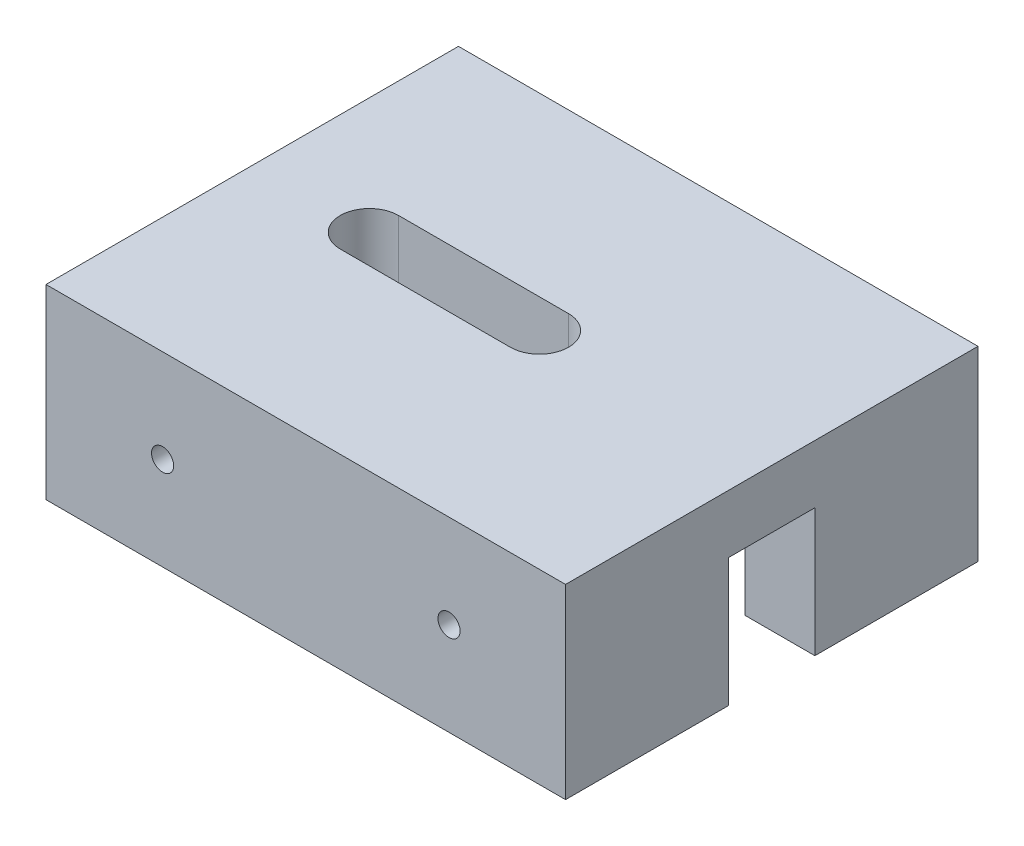
ISO-10303-21;
HEADER;
FILE_DESCRIPTION(('STEP AP214'),'2;1');
FILE_NAME('part.step','',(''),(''),'','','');
FILE_SCHEMA(('AUTOMOTIVE_DESIGN { 1 0 10303 214 1 1 1 1 }'));
ENDSEC;
DATA;
#1=APPLICATION_CONTEXT('core data for automotive mechanical design processes');
#2=APPLICATION_PROTOCOL_DEFINITION('international standard','automotive_design',2000,#1);
#3=PRODUCT_CONTEXT('',#1,'mechanical');
#4=PRODUCT('Part','Part','',(#3));
#5=PRODUCT_RELATED_PRODUCT_CATEGORY('part','',(#4));
#6=PRODUCT_DEFINITION_FORMATION('','',#4);
#7=PRODUCT_DEFINITION_CONTEXT('part definition',#1,'design');
#8=PRODUCT_DEFINITION('design','',#6,#7);
#9=PRODUCT_DEFINITION_SHAPE('','',#8);
#10=(LENGTH_UNIT() NAMED_UNIT(*) SI_UNIT(.MILLI.,.METRE.));
#11=(NAMED_UNIT(*) PLANE_ANGLE_UNIT() SI_UNIT($,.RADIAN.));
#12=(NAMED_UNIT(*) SI_UNIT($,.STERADIAN.) SOLID_ANGLE_UNIT());
#13=UNCERTAINTY_MEASURE_WITH_UNIT(LENGTH_MEASURE(1.E-05),#10,'distance_accuracy_value','');
#14=(GEOMETRIC_REPRESENTATION_CONTEXT(3) GLOBAL_UNCERTAINTY_ASSIGNED_CONTEXT((#13)) GLOBAL_UNIT_ASSIGNED_CONTEXT((#10,
#11,#12)) REPRESENTATION_CONTEXT('',''));
#15=CARTESIAN_POINT('',(0.,0.,0.));
#16=DIRECTION('',(0.,0.,1.));
#17=DIRECTION('',(1.,0.,0.));
#18=AXIS2_PLACEMENT_3D('',#15,#16,#17);
#19=CARTESIAN_POINT('',(0.,0.,17.7));
#20=DIRECTION('',(0.,1.,0.));
#21=DIRECTION('',(0.,0.,1.));
#22=AXIS2_PLACEMENT_3D('',#19,#20,#21);
#23=PLANE('',#22);
#24=DIRECTION('',(0.,0.,-1.));
#25=VECTOR('',#24,1.);
#26=CARTESIAN_POINT('',(0.,0.,17.7));
#27=LINE('',#26,#25);
#28=CARTESIAN_POINT('',(0.,0.,17.7));
#29=VERTEX_POINT('',#28);
#30=CARTESIAN_POINT('',(0.,0.,15.2));
#31=VERTEX_POINT('',#30);
#32=EDGE_CURVE('E293',#29,#31,#27,.T.);
#33=ORIENTED_EDGE('',*,*,#32,.T.);
#34=DIRECTION('',(-1.,0.,0.));
#35=VECTOR('',#34,1.);
#36=CARTESIAN_POINT('',(0.,0.,15.2));
#37=LINE('',#36,#35);
#38=CARTESIAN_POINT('',(19.2964128081511,0.,15.2));
#39=VERTEX_POINT('',#38);
#40=EDGE_CURVE('E221',#39,#31,#37,.T.);
#41=ORIENTED_EDGE('',*,*,#40,.F.);
#42=DIRECTION('',(0.,0.,1.));
#43=VECTOR('',#42,1.);
#44=CARTESIAN_POINT('',(19.2964128081511,0.,15.2));
#45=LINE('',#44,#43);
#46=CARTESIAN_POINT('',(19.2964128081511,0.,10.7));
#47=VERTEX_POINT('',#46);
#48=EDGE_CURVE('E252',#47,#39,#45,.T.);
#49=ORIENTED_EDGE('',*,*,#48,.F.);
#50=DIRECTION('',(-1.,0.,0.));
#51=VECTOR('',#50,1.);
#52=CARTESIAN_POINT('',(19.2964128081511,0.,10.7));
#53=LINE('',#52,#51);
#54=CARTESIAN_POINT('',(22.2964128081511,0.,10.7));
#55=VERTEX_POINT('',#54);
#56=EDGE_CURVE('E249',#55,#47,#53,.T.);
#57=ORIENTED_EDGE('',*,*,#56,.F.);
#58=DIRECTION('',(0.,0.,-1.));
#59=VECTOR('',#58,1.);
#60=CARTESIAN_POINT('',(22.2964128081511,0.,17.7));
#61=LINE('',#60,#59);
#62=CARTESIAN_POINT('',(22.2964128081511,0.,17.7));
#63=VERTEX_POINT('',#62);
#64=EDGE_CURVE('E11',#63,#55,#61,.T.);
#65=ORIENTED_EDGE('',*,*,#64,.F.);
#66=DIRECTION('',(1.,0.,0.));
#67=VECTOR('',#66,1.);
#68=CARTESIAN_POINT('',(0.,0.,17.7));
#69=LINE('',#68,#67);
#70=EDGE_CURVE('E274',#29,#63,#69,.T.);
#71=ORIENTED_EDGE('',*,*,#70,.F.);
#72=EDGE_LOOP('',(#33,#41,#49,#57,#65,#71));
#73=FACE_BOUND('',#72,.T.);
#74=ADVANCED_FACE('F38',(#73),#23,.F.);
#75=CARTESIAN_POINT('',(22.2964128081511,0.,7.));
#76=VERTEX_POINT('',#75);
#77=CARTESIAN_POINT('',(22.2964128081511,0.,0.));
#78=VERTEX_POINT('',#77);
#79=EDGE_CURVE('E46',#76,#78,#61,.T.);
#80=ORIENTED_EDGE('',*,*,#79,.F.);
#81=DIRECTION('',(1.,0.,0.));
#82=VECTOR('',#81,1.);
#83=CARTESIAN_POINT('',(22.2964128081511,0.,7.));
#84=LINE('',#83,#82);
#85=CARTESIAN_POINT('',(19.2964128081511,0.,7.));
#86=VERTEX_POINT('',#85);
#87=EDGE_CURVE('E247',#86,#76,#84,.T.);
#88=ORIENTED_EDGE('',*,*,#87,.F.);
#89=DIRECTION('',(0.,0.,1.));
#90=VECTOR('',#89,1.);
#91=CARTESIAN_POINT('',(19.2964128081511,0.,7.));
#92=LINE('',#91,#90);
#93=CARTESIAN_POINT('',(19.2964128081511,0.,2.5));
#94=VERTEX_POINT('',#93);
#95=EDGE_CURVE('E244',#94,#86,#92,.T.);
#96=ORIENTED_EDGE('',*,*,#95,.F.);
#97=DIRECTION('',(1.,0.,0.));
#98=VECTOR('',#97,1.);
#99=CARTESIAN_POINT('',(19.2964128081511,0.,2.5));
#100=LINE('',#99,#98);
#101=CARTESIAN_POINT('',(0.,0.,2.5));
#102=VERTEX_POINT('',#101);
#103=EDGE_CURVE('E216',#102,#94,#100,.T.);
#104=ORIENTED_EDGE('',*,*,#103,.F.);
#105=CARTESIAN_POINT('',(0.,0.,0.));
#106=VERTEX_POINT('',#105);
#107=EDGE_CURVE('E284',#102,#106,#27,.T.);
#108=ORIENTED_EDGE('',*,*,#107,.T.);
#109=DIRECTION('',(1.,0.,0.));
#110=VECTOR('',#109,1.);
#111=CARTESIAN_POINT('',(0.,0.,0.));
#112=LINE('',#111,#110);
#113=EDGE_CURVE('E259',#106,#78,#112,.T.);
#114=ORIENTED_EDGE('',*,*,#113,.T.);
#115=EDGE_LOOP('',(#80,#88,#96,#104,#108,#114));
#116=FACE_BOUND('',#115,.T.);
#117=ADVANCED_FACE('F40',(#116),#23,.F.);
#118=CARTESIAN_POINT('',(22.2964128081511,8.,17.7));
#119=DIRECTION('',(-1.,0.,0.));
#120=DIRECTION('',(0.,0.,1.));
#121=AXIS2_PLACEMENT_3D('',#118,#119,#120);
#122=PLANE('',#121);
#123=ORIENTED_EDGE('',*,*,#64,.T.);
#124=DIRECTION('',(0.,-1.,0.));
#125=VECTOR('',#124,1.);
#126=CARTESIAN_POINT('',(22.2964128081511,5.5,10.7));
#127=LINE('',#126,#125);
#128=CARTESIAN_POINT('',(22.2964128081511,5.5,10.7));
#129=VERTEX_POINT('',#128);
#130=EDGE_CURVE('E264',#129,#55,#127,.T.);
#131=ORIENTED_EDGE('',*,*,#130,.F.);
#132=DIRECTION('',(0.,0.,1.));
#133=VECTOR('',#132,1.);
#134=CARTESIAN_POINT('',(22.2964128081511,5.5,10.7));
#135=LINE('',#134,#133);
#136=CARTESIAN_POINT('',(22.2964128081511,5.5,7.));
#137=VERTEX_POINT('',#136);
#138=EDGE_CURVE('E230',#137,#129,#135,.T.);
#139=ORIENTED_EDGE('',*,*,#138,.F.);
#140=DIRECTION('',(0.,-1.,0.));
#141=VECTOR('',#140,1.);
#142=CARTESIAN_POINT('',(22.2964128081511,5.5,7.));
#143=LINE('',#142,#141);
#144=EDGE_CURVE('E266',#137,#76,#143,.T.);
#145=ORIENTED_EDGE('',*,*,#144,.T.);
#146=ORIENTED_EDGE('',*,*,#79,.T.);
#147=DIRECTION('',(0.,1.,0.));
#148=VECTOR('',#147,1.);
#149=CARTESIAN_POINT('',(22.2964128081511,8.,0.));
#150=LINE('',#149,#148);
#151=CARTESIAN_POINT('',(22.2964128081511,8.,0.));
#152=VERTEX_POINT('',#151);
#153=EDGE_CURVE('E287',#78,#152,#150,.T.);
#154=ORIENTED_EDGE('',*,*,#153,.T.);
#155=DIRECTION('',(0.,0.,-1.));
#156=VECTOR('',#155,1.);
#157=CARTESIAN_POINT('',(22.2964128081511,8.,17.7));
#158=LINE('',#157,#156);
#159=CARTESIAN_POINT('',(22.2964128081511,8.,17.7));
#160=VERTEX_POINT('',#159);
#161=EDGE_CURVE('E298',#160,#152,#158,.T.);
#162=ORIENTED_EDGE('',*,*,#161,.F.);
#163=DIRECTION('',(0.,1.,0.));
#164=VECTOR('',#163,1.);
#165=CARTESIAN_POINT('',(22.2964128081511,8.,17.7));
#166=LINE('',#165,#164);
#167=EDGE_CURVE('E277',#63,#160,#166,.T.);
#168=ORIENTED_EDGE('',*,*,#167,.F.);
#169=EDGE_LOOP('',(#123,#131,#139,#145,#146,#154,#162,#168));
#170=FACE_BOUND('',#169,.T.);
#171=ADVANCED_FACE('F307',(#170),#122,.F.);
#172=CARTESIAN_POINT('',(0.,8.,17.7));
#173=DIRECTION('',(0.,-1.,0.));
#174=DIRECTION('',(0.,0.,-1.));
#175=AXIS2_PLACEMENT_3D('',#172,#173,#174);
#176=PLANE('',#175);
#177=DIRECTION('',(1.,0.,0.));
#178=VECTOR('',#177,1.);
#179=CARTESIAN_POINT('',(5.,8.,10.0708180568554));
#180=LINE('',#179,#178);
#181=CARTESIAN_POINT('',(5.,8.,10.0708180568554));
#182=VERTEX_POINT('',#181);
#183=CARTESIAN_POINT('',(12.2964128081511,8.,10.0708180568554));
#184=VERTEX_POINT('',#183);
#185=EDGE_CURVE('E189',#182,#184,#180,.T.);
#186=ORIENTED_EDGE('',*,*,#185,.F.);
#187=CARTESIAN_POINT('',(5.,8.,8.82081805685545));
#188=DIRECTION('',(0.,-1.,0.));
#189=DIRECTION('',(0.,0.,-1.));
#190=AXIS2_PLACEMENT_3D('',#187,#188,#189);
#191=CIRCLE('',#190,1.25);
#192=CARTESIAN_POINT('',(5.,8.,7.57081805685544));
#193=VERTEX_POINT('',#192);
#194=EDGE_CURVE('E192',#193,#182,#191,.F.);
#195=ORIENTED_EDGE('',*,*,#194,.F.);
#196=DIRECTION('',(-1.,0.,0.));
#197=VECTOR('',#196,1.);
#198=CARTESIAN_POINT('',(5.,8.,7.57081805685544));
#199=LINE('',#198,#197);
#200=CARTESIAN_POINT('',(12.2964128081511,8.,7.57081805685544));
#201=VERTEX_POINT('',#200);
#202=EDGE_CURVE('E208',#201,#193,#199,.T.);
#203=ORIENTED_EDGE('',*,*,#202,.F.);
#204=CARTESIAN_POINT('',(12.2964128081511,8.,8.82081805685545));
#205=DIRECTION('',(0.,-1.,0.));
#206=DIRECTION('',(0.,0.,-1.));
#207=AXIS2_PLACEMENT_3D('',#204,#205,#206);
#208=CIRCLE('',#207,1.25);
#209=EDGE_CURVE('E53',#184,#201,#208,.F.);
#210=ORIENTED_EDGE('',*,*,#209,.F.);
#211=EDGE_LOOP('',(#186,#195,#203,#210));
#212=FACE_BOUND('',#211,.T.);
#213=DIRECTION('',(-1.,0.,0.));
#214=VECTOR('',#213,1.);
#215=CARTESIAN_POINT('',(0.,8.,0.));
#216=LINE('',#215,#214);
#217=CARTESIAN_POINT('',(0.,8.,0.));
#218=VERTEX_POINT('',#217);
#219=EDGE_CURVE('E289',#152,#218,#216,.T.);
#220=ORIENTED_EDGE('',*,*,#219,.T.);
#221=DIRECTION('',(0.,0.,-1.));
#222=VECTOR('',#221,1.);
#223=CARTESIAN_POINT('',(0.,8.,17.7));
#224=LINE('',#223,#222);
#225=CARTESIAN_POINT('',(0.,8.,17.7));
#226=VERTEX_POINT('',#225);
#227=EDGE_CURVE('E296',#226,#218,#224,.T.);
#228=ORIENTED_EDGE('',*,*,#227,.F.);
#229=DIRECTION('',(-1.,0.,0.));
#230=VECTOR('',#229,1.);
#231=CARTESIAN_POINT('',(0.,8.,17.7));
#232=LINE('',#231,#230);
#233=EDGE_CURVE('E280',#160,#226,#232,.T.);
#234=ORIENTED_EDGE('',*,*,#233,.F.);
#235=ORIENTED_EDGE('',*,*,#161,.T.);
#236=EDGE_LOOP('',(#220,#228,#234,#235));
#237=FACE_BOUND('',#236,.T.);
#238=ADVANCED_FACE('F325',(#212,#237),#176,.F.);
#239=CARTESIAN_POINT('',(0.,0.,17.7));
#240=DIRECTION('',(1.,0.,0.));
#241=DIRECTION('',(0.,0.,-1.));
#242=AXIS2_PLACEMENT_3D('',#239,#240,#241);
#243=PLANE('',#242);
#244=DIRECTION('',(0.,0.,-1.));
#245=VECTOR('',#244,1.);
#246=CARTESIAN_POINT('',(0.,5.5,2.5));
#247=LINE('',#246,#245);
#248=CARTESIAN_POINT('',(0.,5.5,15.2));
#249=VERTEX_POINT('',#248);
#250=CARTESIAN_POINT('',(0.,5.5,2.5));
#251=VERTEX_POINT('',#250);
#252=EDGE_CURVE('E217',#249,#251,#247,.T.);
#253=ORIENTED_EDGE('',*,*,#252,.F.);
#254=DIRECTION('',(0.,-1.,0.));
#255=VECTOR('',#254,1.);
#256=CARTESIAN_POINT('',(0.,5.5,15.2));
#257=LINE('',#256,#255);
#258=EDGE_CURVE('E256',#249,#31,#257,.T.);
#259=ORIENTED_EDGE('',*,*,#258,.T.);
#260=ORIENTED_EDGE('',*,*,#32,.F.);
#261=DIRECTION('',(0.,-1.,0.));
#262=VECTOR('',#261,1.);
#263=CARTESIAN_POINT('',(0.,0.,17.7));
#264=LINE('',#263,#262);
#265=EDGE_CURVE('E282',#226,#29,#264,.T.);
#266=ORIENTED_EDGE('',*,*,#265,.F.);
#267=ORIENTED_EDGE('',*,*,#227,.T.);
#268=DIRECTION('',(0.,-1.,0.));
#269=VECTOR('',#268,1.);
#270=CARTESIAN_POINT('',(0.,0.,0.));
#271=LINE('',#270,#269);
#272=EDGE_CURVE('E278',#218,#106,#271,.T.);
#273=ORIENTED_EDGE('',*,*,#272,.T.);
#274=ORIENTED_EDGE('',*,*,#107,.F.);
#275=DIRECTION('',(0.,-1.,0.));
#276=VECTOR('',#275,1.);
#277=CARTESIAN_POINT('',(0.,5.5,2.5));
#278=LINE('',#277,#276);
#279=EDGE_CURVE('E241',#251,#102,#278,.T.);
#280=ORIENTED_EDGE('',*,*,#279,.F.);
#281=EDGE_LOOP('',(#253,#259,#260,#266,#267,#273,#274,#280));
#282=FACE_BOUND('',#281,.T.);
#283=ADVANCED_FACE('F321',(#282),#243,.F.);
#284=CARTESIAN_POINT('',(0.,0.,17.7));
#285=DIRECTION('',(0.,0.,-1.));
#286=DIRECTION('',(-1.,0.,0.));
#287=AXIS2_PLACEMENT_3D('',#284,#285,#286);
#288=PLANE('',#287);
#289=CARTESIAN_POINT('',(17.2964128081511,4.,17.7));
#290=DIRECTION('',(0.,0.,1.));
#291=DIRECTION('',(1.,0.,0.));
#292=AXIS2_PLACEMENT_3D('',#289,#290,#291);
#293=CIRCLE('',#292,0.475);
#294=CARTESIAN_POINT('',(17.7714128081511,4.,17.7));
#295=VERTEX_POINT('',#294);
#296=EDGE_CURVE('E166',#295,#295,#293,.T.);
#297=ORIENTED_EDGE('',*,*,#296,.F.);
#298=EDGE_LOOP('',(#297));
#299=FACE_BOUND('',#298,.T.);
#300=CARTESIAN_POINT('',(5.00315478500113,4.,17.7));
#301=DIRECTION('',(0.,0.,1.));
#302=DIRECTION('',(1.,0.,0.));
#303=AXIS2_PLACEMENT_3D('',#300,#301,#302);
#304=CIRCLE('',#303,0.475);
#305=CARTESIAN_POINT('',(5.47815478500113,4.,17.7));
#306=VERTEX_POINT('',#305);
#307=EDGE_CURVE('E165',#306,#306,#304,.T.);
#308=ORIENTED_EDGE('',*,*,#307,.F.);
#309=EDGE_LOOP('',(#308));
#310=FACE_BOUND('',#309,.T.);
#311=ORIENTED_EDGE('',*,*,#70,.T.);
#312=ORIENTED_EDGE('',*,*,#167,.T.);
#313=ORIENTED_EDGE('',*,*,#233,.T.);
#314=ORIENTED_EDGE('',*,*,#265,.T.);
#315=EDGE_LOOP('',(#311,#312,#313,#314));
#316=FACE_BOUND('',#315,.T.);
#317=ADVANCED_FACE('F327',(#299,#310,#316),#288,.F.);
#318=CARTESIAN_POINT('',(0.,0.,0.));
#319=DIRECTION('',(0.,0.,-1.));
#320=DIRECTION('',(-1.,0.,0.));
#321=AXIS2_PLACEMENT_3D('',#318,#319,#320);
#322=PLANE('',#321);
#323=ORIENTED_EDGE('',*,*,#113,.F.);
#324=ORIENTED_EDGE('',*,*,#272,.F.);
#325=ORIENTED_EDGE('',*,*,#219,.F.);
#326=ORIENTED_EDGE('',*,*,#153,.F.);
#327=EDGE_LOOP('',(#323,#324,#325,#326));
#328=FACE_BOUND('',#327,.T.);
#329=ADVANCED_FACE('F313',(#328),#322,.T.);
#330=CARTESIAN_POINT('',(0.,5.5,15.2));
#331=DIRECTION('',(0.,0.,1.));
#332=DIRECTION('',(1.,0.,0.));
#333=AXIS2_PLACEMENT_3D('',#330,#331,#332);
#334=PLANE('',#333);
#335=ORIENTED_EDGE('',*,*,#40,.T.);
#336=ORIENTED_EDGE('',*,*,#258,.F.);
#337=DIRECTION('',(-1.,0.,0.));
#338=VECTOR('',#337,1.);
#339=CARTESIAN_POINT('',(0.,5.5,15.2));
#340=LINE('',#339,#338);
#341=CARTESIAN_POINT('',(19.2964128081511,5.5,15.2));
#342=VERTEX_POINT('',#341);
#343=EDGE_CURVE('E239',#342,#249,#340,.T.);
#344=ORIENTED_EDGE('',*,*,#343,.F.);
#345=DIRECTION('',(0.,-1.,0.));
#346=VECTOR('',#345,1.);
#347=CARTESIAN_POINT('',(19.2964128081511,5.5,15.2));
#348=LINE('',#347,#346);
#349=EDGE_CURVE('E260',#342,#39,#348,.T.);
#350=ORIENTED_EDGE('',*,*,#349,.T.);
#351=EDGE_LOOP('',(#335,#336,#344,#350));
#352=FACE_BOUND('',#351,.T.);
#353=ADVANCED_FACE('F351',(#352),#334,.F.);
#354=CARTESIAN_POINT('',(19.2964128081511,5.5,15.2));
#355=DIRECTION('',(1.,0.,0.));
#356=DIRECTION('',(0.,0.,-1.));
#357=AXIS2_PLACEMENT_3D('',#354,#355,#356);
#358=PLANE('',#357);
#359=CARTESIAN_POINT('',(19.2964128081511,2.75,12.95));
#360=DIRECTION('',(-1.,0.,0.));
#361=DIRECTION('',(0.,0.,1.));
#362=AXIS2_PLACEMENT_3D('',#359,#360,#361);
#363=CIRCLE('',#362,1.5);
#364=CARTESIAN_POINT('',(19.2964128081511,2.75,14.45));
#365=VERTEX_POINT('',#364);
#366=EDGE_CURVE('E176',#365,#365,#363,.T.);
#367=ORIENTED_EDGE('',*,*,#366,.F.);
#368=EDGE_LOOP('',(#367));
#369=FACE_BOUND('',#368,.T.);
#370=ORIENTED_EDGE('',*,*,#48,.T.);
#371=ORIENTED_EDGE('',*,*,#349,.F.);
#372=DIRECTION('',(0.,0.,1.));
#373=VECTOR('',#372,1.);
#374=CARTESIAN_POINT('',(19.2964128081511,5.5,15.2));
#375=LINE('',#374,#373);
#376=CARTESIAN_POINT('',(19.2964128081511,5.5,10.7));
#377=VERTEX_POINT('',#376);
#378=EDGE_CURVE('E236',#377,#342,#375,.T.);
#379=ORIENTED_EDGE('',*,*,#378,.F.);
#380=DIRECTION('',(0.,-1.,0.));
#381=VECTOR('',#380,1.);
#382=CARTESIAN_POINT('',(19.2964128081511,5.5,10.7));
#383=LINE('',#382,#381);
#384=EDGE_CURVE('E262',#377,#47,#383,.T.);
#385=ORIENTED_EDGE('',*,*,#384,.T.);
#386=EDGE_LOOP('',(#370,#371,#379,#385));
#387=FACE_BOUND('',#386,.T.);
#388=ADVANCED_FACE('F353',(#369,#387),#358,.F.);
#389=CARTESIAN_POINT('',(19.2964128081511,5.5,10.7));
#390=DIRECTION('',(0.,0.,1.));
#391=DIRECTION('',(1.,0.,0.));
#392=AXIS2_PLACEMENT_3D('',#389,#390,#391);
#393=PLANE('',#392);
#394=ORIENTED_EDGE('',*,*,#56,.T.);
#395=ORIENTED_EDGE('',*,*,#384,.F.);
#396=DIRECTION('',(-1.,0.,0.));
#397=VECTOR('',#396,1.);
#398=CARTESIAN_POINT('',(19.2964128081511,5.5,10.7));
#399=LINE('',#398,#397);
#400=EDGE_CURVE('E233',#129,#377,#399,.T.);
#401=ORIENTED_EDGE('',*,*,#400,.F.);
#402=ORIENTED_EDGE('',*,*,#130,.T.);
#403=EDGE_LOOP('',(#394,#395,#401,#402));
#404=FACE_BOUND('',#403,.T.);
#405=ADVANCED_FACE('F336',(#404),#393,.F.);
#406=CARTESIAN_POINT('',(22.2964128081511,5.5,7.));
#407=DIRECTION('',(0.,0.,-1.));
#408=DIRECTION('',(-1.,0.,0.));
#409=AXIS2_PLACEMENT_3D('',#406,#407,#408);
#410=PLANE('',#409);
#411=ORIENTED_EDGE('',*,*,#87,.T.);
#412=ORIENTED_EDGE('',*,*,#144,.F.);
#413=DIRECTION('',(1.,0.,0.));
#414=VECTOR('',#413,1.);
#415=CARTESIAN_POINT('',(22.2964128081511,5.5,7.));
#416=LINE('',#415,#414);
#417=CARTESIAN_POINT('',(19.2964128081511,5.5,7.));
#418=VERTEX_POINT('',#417);
#419=EDGE_CURVE('E227',#418,#137,#416,.T.);
#420=ORIENTED_EDGE('',*,*,#419,.F.);
#421=DIRECTION('',(0.,-1.,0.));
#422=VECTOR('',#421,1.);
#423=CARTESIAN_POINT('',(19.2964128081511,5.5,7.));
#424=LINE('',#423,#422);
#425=EDGE_CURVE('E269',#418,#86,#424,.T.);
#426=ORIENTED_EDGE('',*,*,#425,.T.);
#427=EDGE_LOOP('',(#411,#412,#420,#426));
#428=FACE_BOUND('',#427,.T.);
#429=ADVANCED_FACE('F343',(#428),#410,.F.);
#430=CARTESIAN_POINT('',(19.2964128081511,5.5,7.));
#431=DIRECTION('',(1.,0.,0.));
#432=DIRECTION('',(0.,0.,-1.));
#433=AXIS2_PLACEMENT_3D('',#430,#431,#432);
#434=PLANE('',#433);
#435=CARTESIAN_POINT('',(19.2964128081511,2.75,4.75));
#436=DIRECTION('',(-1.,0.,0.));
#437=DIRECTION('',(0.,0.,1.));
#438=AXIS2_PLACEMENT_3D('',#435,#436,#437);
#439=CIRCLE('',#438,1.5);
#440=CARTESIAN_POINT('',(19.2964128081511,2.75,6.25));
#441=VERTEX_POINT('',#440);
#442=EDGE_CURVE('E180',#441,#441,#439,.T.);
#443=ORIENTED_EDGE('',*,*,#442,.F.);
#444=EDGE_LOOP('',(#443));
#445=FACE_BOUND('',#444,.T.);
#446=ORIENTED_EDGE('',*,*,#95,.T.);
#447=ORIENTED_EDGE('',*,*,#425,.F.);
#448=DIRECTION('',(0.,0.,1.));
#449=VECTOR('',#448,1.);
#450=CARTESIAN_POINT('',(19.2964128081511,5.5,7.));
#451=LINE('',#450,#449);
#452=CARTESIAN_POINT('',(19.2964128081511,5.5,2.5));
#453=VERTEX_POINT('',#452);
#454=EDGE_CURVE('E224',#453,#418,#451,.T.);
#455=ORIENTED_EDGE('',*,*,#454,.F.);
#456=DIRECTION('',(0.,-1.,0.));
#457=VECTOR('',#456,1.);
#458=CARTESIAN_POINT('',(19.2964128081511,5.5,2.5));
#459=LINE('',#458,#457);
#460=EDGE_CURVE('E271',#453,#94,#459,.T.);
#461=ORIENTED_EDGE('',*,*,#460,.T.);
#462=EDGE_LOOP('',(#446,#447,#455,#461));
#463=FACE_BOUND('',#462,.T.);
#464=ADVANCED_FACE('F345',(#445,#463),#434,.F.);
#465=CARTESIAN_POINT('',(19.2964128081511,5.5,2.5));
#466=DIRECTION('',(0.,0.,-1.));
#467=DIRECTION('',(-1.,0.,0.));
#468=AXIS2_PLACEMENT_3D('',#465,#466,#467);
#469=PLANE('',#468);
#470=ORIENTED_EDGE('',*,*,#103,.T.);
#471=ORIENTED_EDGE('',*,*,#460,.F.);
#472=DIRECTION('',(1.,0.,0.));
#473=VECTOR('',#472,1.);
#474=CARTESIAN_POINT('',(19.2964128081511,5.5,2.5));
#475=LINE('',#474,#473);
#476=EDGE_CURVE('E220',#251,#453,#475,.T.);
#477=ORIENTED_EDGE('',*,*,#476,.F.);
#478=ORIENTED_EDGE('',*,*,#279,.T.);
#479=EDGE_LOOP('',(#470,#471,#477,#478));
#480=FACE_BOUND('',#479,.T.);
#481=ADVANCED_FACE('F347',(#480),#469,.F.);
#482=CARTESIAN_POINT('',(0.,5.5,0.));
#483=DIRECTION('',(0.,1.,0.));
#484=DIRECTION('',(0.,0.,1.));
#485=AXIS2_PLACEMENT_3D('',#482,#483,#484);
#486=PLANE('',#485);
#487=DIRECTION('',(1.,0.,0.));
#488=VECTOR('',#487,1.);
#489=CARTESIAN_POINT('',(5.,5.5,7.57081805685544));
#490=LINE('',#489,#488);
#491=CARTESIAN_POINT('',(5.,5.5,7.57081805685544));
#492=VERTEX_POINT('',#491);
#493=CARTESIAN_POINT('',(12.2964128081511,5.5,7.57081805685544));
#494=VERTEX_POINT('',#493);
#495=EDGE_CURVE('E196',#492,#494,#490,.T.);
#496=ORIENTED_EDGE('',*,*,#495,.F.);
#497=CARTESIAN_POINT('',(5.,5.5,8.82081805685545));
#498=DIRECTION('',(0.,-1.,0.));
#499=DIRECTION('',(0.,0.,-1.));
#500=AXIS2_PLACEMENT_3D('',#497,#498,#499);
#501=CIRCLE('',#500,1.25);
#502=CARTESIAN_POINT('',(5.,5.5,10.0708180568554));
#503=VERTEX_POINT('',#502);
#504=EDGE_CURVE('E61',#503,#492,#501,.T.);
#505=ORIENTED_EDGE('',*,*,#504,.F.);
#506=DIRECTION('',(-1.,0.,0.));
#507=VECTOR('',#506,1.);
#508=CARTESIAN_POINT('',(5.,5.5,10.0708180568554));
#509=LINE('',#508,#507);
#510=CARTESIAN_POINT('',(12.2964128081511,5.5,10.0708180568554));
#511=VERTEX_POINT('',#510);
#512=EDGE_CURVE('E202',#511,#503,#509,.T.);
#513=ORIENTED_EDGE('',*,*,#512,.F.);
#514=CARTESIAN_POINT('',(12.2964128081511,5.5,8.82081805685545));
#515=DIRECTION('',(0.,-1.,0.));
#516=DIRECTION('',(0.,0.,-1.));
#517=AXIS2_PLACEMENT_3D('',#514,#515,#516);
#518=CIRCLE('',#517,1.25);
#519=EDGE_CURVE('E199',#494,#511,#518,.T.);
#520=ORIENTED_EDGE('',*,*,#519,.F.);
#521=EDGE_LOOP('',(#496,#505,#513,#520));
#522=FACE_BOUND('',#521,.T.);
#523=ORIENTED_EDGE('',*,*,#252,.T.);
#524=ORIENTED_EDGE('',*,*,#476,.T.);
#525=ORIENTED_EDGE('',*,*,#454,.T.);
#526=ORIENTED_EDGE('',*,*,#419,.T.);
#527=ORIENTED_EDGE('',*,*,#138,.T.);
#528=ORIENTED_EDGE('',*,*,#400,.T.);
#529=ORIENTED_EDGE('',*,*,#378,.T.);
#530=ORIENTED_EDGE('',*,*,#343,.T.);
#531=EDGE_LOOP('',(#523,#524,#525,#526,#527,#528,#529,#530));
#532=FACE_BOUND('',#531,.T.);
#533=ADVANCED_FACE('F339',(#522,#532),#486,.F.);
#534=CARTESIAN_POINT('',(5.,8.001,8.82081805685545));
#535=DIRECTION('',(0.,-1.,0.));
#536=DIRECTION('',(0.,0.,-1.));
#537=AXIS2_PLACEMENT_3D('',#534,#535,#536);
#538=CYLINDRICAL_SURFACE('',#537,1.25);
#539=ORIENTED_EDGE('',*,*,#194,.T.);
#540=DIRECTION('',(0.,-1.,0.));
#541=VECTOR('',#540,1.);
#542=CARTESIAN_POINT('',(5.,8.001,10.0708180568554));
#543=LINE('',#542,#541);
#544=EDGE_CURVE('E206',#182,#503,#543,.T.);
#545=ORIENTED_EDGE('',*,*,#544,.T.);
#546=ORIENTED_EDGE('',*,*,#504,.T.);
#547=DIRECTION('',(0.,-1.,0.));
#548=VECTOR('',#547,1.);
#549=CARTESIAN_POINT('',(5.,8.001,7.57081805685544));
#550=LINE('',#549,#548);
#551=EDGE_CURVE('E205',#193,#492,#550,.T.);
#552=ORIENTED_EDGE('',*,*,#551,.F.);
#553=EDGE_LOOP('',(#539,#545,#546,#552));
#554=FACE_BOUND('',#553,.T.);
#555=ADVANCED_FACE('F410',(#554),#538,.F.);
#556=CARTESIAN_POINT('',(5.,8.001,10.0708180568554));
#557=DIRECTION('',(0.,0.,1.));
#558=DIRECTION('',(1.,0.,0.));
#559=AXIS2_PLACEMENT_3D('',#556,#557,#558);
#560=PLANE('',#559);
#561=ORIENTED_EDGE('',*,*,#185,.T.);
#562=DIRECTION('',(0.,-1.,0.));
#563=VECTOR('',#562,1.);
#564=CARTESIAN_POINT('',(12.2964128081511,8.001,10.0708180568554));
#565=LINE('',#564,#563);
#566=EDGE_CURVE('E209',#184,#511,#565,.T.);
#567=ORIENTED_EDGE('',*,*,#566,.T.);
#568=ORIENTED_EDGE('',*,*,#512,.T.);
#569=ORIENTED_EDGE('',*,*,#544,.F.);
#570=EDGE_LOOP('',(#561,#567,#568,#569));
#571=FACE_BOUND('',#570,.T.);
#572=ADVANCED_FACE('F418',(#571),#560,.F.);
#573=CARTESIAN_POINT('',(12.2964128081511,8.001,8.82081805685545));
#574=DIRECTION('',(0.,-1.,0.));
#575=DIRECTION('',(0.,0.,-1.));
#576=AXIS2_PLACEMENT_3D('',#573,#574,#575);
#577=CYLINDRICAL_SURFACE('',#576,1.25);
#578=ORIENTED_EDGE('',*,*,#209,.T.);
#579=DIRECTION('',(0.,-1.,0.));
#580=VECTOR('',#579,1.);
#581=CARTESIAN_POINT('',(12.2964128081511,8.001,7.57081805685544));
#582=LINE('',#581,#580);
#583=EDGE_CURVE('E211',#201,#494,#582,.T.);
#584=ORIENTED_EDGE('',*,*,#583,.T.);
#585=ORIENTED_EDGE('',*,*,#519,.T.);
#586=ORIENTED_EDGE('',*,*,#566,.F.);
#587=EDGE_LOOP('',(#578,#584,#585,#586));
#588=FACE_BOUND('',#587,.T.);
#589=ADVANCED_FACE('F425',(#588),#577,.F.);
#590=CARTESIAN_POINT('',(5.,8.001,7.57081805685544));
#591=DIRECTION('',(0.,0.,-1.));
#592=DIRECTION('',(-1.,0.,0.));
#593=AXIS2_PLACEMENT_3D('',#590,#591,#592);
#594=PLANE('',#593);
#595=ORIENTED_EDGE('',*,*,#202,.T.);
#596=ORIENTED_EDGE('',*,*,#551,.T.);
#597=ORIENTED_EDGE('',*,*,#495,.T.);
#598=ORIENTED_EDGE('',*,*,#583,.F.);
#599=EDGE_LOOP('',(#595,#596,#597,#598));
#600=FACE_BOUND('',#599,.T.);
#601=ADVANCED_FACE('F433',(#600),#594,.F.);
#602=CARTESIAN_POINT('',(21.2964128081511,2.75,4.75));
#603=DIRECTION('',(-1.,0.,0.));
#604=DIRECTION('',(0.,0.,1.));
#605=AXIS2_PLACEMENT_3D('',#602,#603,#604);
#606=CYLINDRICAL_SURFACE('',#605,1.5);
#607=CARTESIAN_POINT('',(21.2964128081511,2.75,4.75));
#608=DIRECTION('',(-1.,0.,0.));
#609=DIRECTION('',(0.,0.,1.));
#610=AXIS2_PLACEMENT_3D('',#607,#608,#609);
#611=CIRCLE('',#610,1.5);
#612=CARTESIAN_POINT('',(21.2964128081511,2.75,6.25));
#613=VERTEX_POINT('',#612);
#614=EDGE_CURVE('E177',#613,#613,#611,.T.);
#615=ORIENTED_EDGE('',*,*,#614,.F.);
#616=EDGE_LOOP('',(#615));
#617=FACE_BOUND('',#616,.T.);
#618=ORIENTED_EDGE('',*,*,#442,.T.);
#619=EDGE_LOOP('',(#618));
#620=FACE_BOUND('',#619,.T.);
#621=ADVANCED_FACE('F440',(#617,#620),#606,.F.);
#622=CARTESIAN_POINT('',(21.2964128081511,2.75,4.75));
#623=DIRECTION('',(-1.,0.,0.));
#624=DIRECTION('',(0.,0.,1.));
#625=AXIS2_PLACEMENT_3D('',#622,#623,#624);
#626=PLANE('',#625);
#627=ORIENTED_EDGE('',*,*,#614,.T.);
#628=EDGE_LOOP('',(#627));
#629=FACE_BOUND('',#628,.T.);
#630=ADVANCED_FACE('F447',(#629),#626,.T.);
#631=CARTESIAN_POINT('',(21.2964128081511,2.75,12.95));
#632=DIRECTION('',(-1.,0.,0.));
#633=DIRECTION('',(0.,0.,1.));
#634=AXIS2_PLACEMENT_3D('',#631,#632,#633);
#635=CYLINDRICAL_SURFACE('',#634,1.5);
#636=CARTESIAN_POINT('',(21.2964128081511,2.75,12.95));
#637=DIRECTION('',(-1.,0.,0.));
#638=DIRECTION('',(0.,0.,1.));
#639=AXIS2_PLACEMENT_3D('',#636,#637,#638);
#640=CIRCLE('',#639,1.5);
#641=CARTESIAN_POINT('',(21.2964128081511,2.75,14.45));
#642=VERTEX_POINT('',#641);
#643=EDGE_CURVE('E183',#642,#642,#640,.T.);
#644=ORIENTED_EDGE('',*,*,#643,.F.);
#645=EDGE_LOOP('',(#644));
#646=FACE_BOUND('',#645,.T.);
#647=ORIENTED_EDGE('',*,*,#366,.T.);
#648=EDGE_LOOP('',(#647));
#649=FACE_BOUND('',#648,.T.);
#650=ADVANCED_FACE('F455',(#646,#649),#635,.F.);
#651=CARTESIAN_POINT('',(21.2964128081511,2.75,12.95));
#652=DIRECTION('',(-1.,0.,0.));
#653=DIRECTION('',(0.,0.,1.));
#654=AXIS2_PLACEMENT_3D('',#651,#652,#653);
#655=PLANE('',#654);
#656=ORIENTED_EDGE('',*,*,#643,.T.);
#657=EDGE_LOOP('',(#656));
#658=FACE_BOUND('',#657,.T.);
#659=ADVANCED_FACE('F463',(#658),#655,.T.);
#660=CARTESIAN_POINT('',(5.00315478500113,4.,15.7));
#661=DIRECTION('',(0.,0.,1.));
#662=DIRECTION('',(1.,0.,0.));
#663=AXIS2_PLACEMENT_3D('',#660,#661,#662);
#664=CONICAL_SURFACE('',#663,0.475,1.02974425867666);
#665=CARTESIAN_POINT('',(5.00315478500113,4.,15.4145912059619));
#666=VERTEX_POINT('',#665);
#667=VERTEX_LOOP('',#666);
#668=FACE_BOUND('',#667,.T.);
#669=CARTESIAN_POINT('',(5.00315478500113,4.,15.7));
#670=DIRECTION('',(0.,0.,1.));
#671=DIRECTION('',(1.,0.,0.));
#672=AXIS2_PLACEMENT_3D('',#669,#670,#671);
#673=CIRCLE('',#672,0.475);
#674=CARTESIAN_POINT('',(5.47815478500113,4.,15.7));
#675=VERTEX_POINT('',#674);
#676=EDGE_CURVE('E169',#675,#675,#673,.T.);
#677=ORIENTED_EDGE('',*,*,#676,.T.);
#678=EDGE_LOOP('',(#677));
#679=FACE_BOUND('',#678,.T.);
#680=ADVANCED_FACE('F471',(#668,#679),#664,.F.);
#681=CARTESIAN_POINT('',(5.00315478500113,4.,17.7));
#682=DIRECTION('',(0.,0.,1.));
#683=DIRECTION('',(1.,0.,0.));
#684=AXIS2_PLACEMENT_3D('',#681,#682,#683);
#685=CYLINDRICAL_SURFACE('',#684,0.475);
#686=ORIENTED_EDGE('',*,*,#676,.F.);
#687=EDGE_LOOP('',(#686));
#688=FACE_BOUND('',#687,.T.);
#689=ORIENTED_EDGE('',*,*,#307,.T.);
#690=EDGE_LOOP('',(#689));
#691=FACE_BOUND('',#690,.T.);
#692=ADVANCED_FACE('F159',(#688,#691),#685,.F.);
#693=CARTESIAN_POINT('',(17.2964128081511,4.,15.7));
#694=DIRECTION('',(0.,0.,1.));
#695=DIRECTION('',(1.,0.,0.));
#696=AXIS2_PLACEMENT_3D('',#693,#694,#695);
#697=CONICAL_SURFACE('',#696,0.475,1.02974425867666);
#698=CARTESIAN_POINT('',(17.2964128081511,4.,15.4145912059619));
#699=VERTEX_POINT('',#698);
#700=VERTEX_LOOP('',#699);
#701=FACE_BOUND('',#700,.T.);
#702=CARTESIAN_POINT('',(17.2964128081511,4.,15.7));
#703=DIRECTION('',(0.,0.,1.));
#704=DIRECTION('',(1.,0.,0.));
#705=AXIS2_PLACEMENT_3D('',#702,#703,#704);
#706=CIRCLE('',#705,0.475);
#707=CARTESIAN_POINT('',(17.7714128081511,4.,15.7));
#708=VERTEX_POINT('',#707);
#709=EDGE_CURVE('E163',#708,#708,#706,.T.);
#710=ORIENTED_EDGE('',*,*,#709,.T.);
#711=EDGE_LOOP('',(#710));
#712=FACE_BOUND('',#711,.T.);
#713=ADVANCED_FACE('F155',(#701,#712),#697,.F.);
#714=CARTESIAN_POINT('',(17.2964128081511,4.,17.7));
#715=DIRECTION('',(0.,0.,1.));
#716=DIRECTION('',(1.,0.,0.));
#717=AXIS2_PLACEMENT_3D('',#714,#715,#716);
#718=CYLINDRICAL_SURFACE('',#717,0.475);
#719=ORIENTED_EDGE('',*,*,#709,.F.);
#720=EDGE_LOOP('',(#719));
#721=FACE_BOUND('',#720,.T.);
#722=ORIENTED_EDGE('',*,*,#296,.T.);
#723=EDGE_LOOP('',(#722));
#724=FACE_BOUND('',#723,.T.);
#725=ADVANCED_FACE('F158',(#721,#724),#718,.F.);
#726=CLOSED_SHELL('',(#74,#117,#171,#238,#283,#317,#329,#353,#388,#405,#429,#464,#481,#533,#555,
#572,#589,#601,#621,#630,#650,#659,#680,#692,#713,#725));
#727=MANIFOLD_SOLID_BREP('B2',#726);
#728=ADVANCED_BREP_SHAPE_REPRESENTATION('',(#18,#727),#14);
#729=SHAPE_DEFINITION_REPRESENTATION(#9,#728);
ENDSEC;
END-ISO-10303-21;
